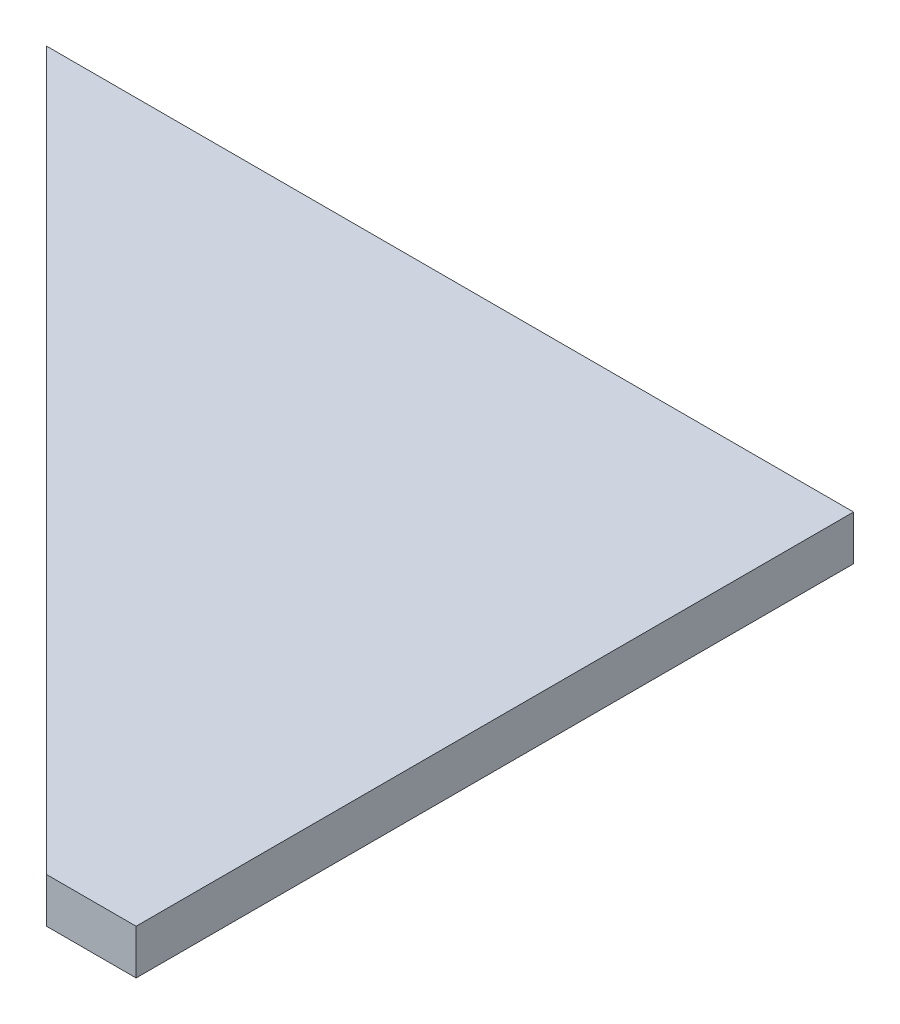
ISO-10303-21;
HEADER;
FILE_DESCRIPTION(('STEP AP214'),'2;1');
FILE_NAME('part.step','',(''),(''),'','','');
FILE_SCHEMA(('AUTOMOTIVE_DESIGN { 1 0 10303 214 1 1 1 1 }'));
ENDSEC;
DATA;
#1=APPLICATION_CONTEXT('core data for automotive mechanical design processes');
#2=APPLICATION_PROTOCOL_DEFINITION('international standard','automotive_design',2000,#1);
#3=PRODUCT_CONTEXT('',#1,'mechanical');
#4=PRODUCT('Part','Part','',(#3));
#5=PRODUCT_RELATED_PRODUCT_CATEGORY('part','',(#4));
#6=PRODUCT_DEFINITION_FORMATION('','',#4);
#7=PRODUCT_DEFINITION_CONTEXT('part definition',#1,'design');
#8=PRODUCT_DEFINITION('design','',#6,#7);
#9=PRODUCT_DEFINITION_SHAPE('','',#8);
#10=(LENGTH_UNIT() NAMED_UNIT(*) SI_UNIT(.MILLI.,.METRE.));
#11=(NAMED_UNIT(*) PLANE_ANGLE_UNIT() SI_UNIT($,.RADIAN.));
#12=(NAMED_UNIT(*) SI_UNIT($,.STERADIAN.) SOLID_ANGLE_UNIT());
#13=UNCERTAINTY_MEASURE_WITH_UNIT(LENGTH_MEASURE(1.E-05),#10,'distance_accuracy_value','');
#14=(GEOMETRIC_REPRESENTATION_CONTEXT(3) GLOBAL_UNCERTAINTY_ASSIGNED_CONTEXT((#13)) GLOBAL_UNIT_ASSIGNED_CONTEXT((#10,
#11,#12)) REPRESENTATION_CONTEXT('',''));
#15=CARTESIAN_POINT('',(0.,0.,0.));
#16=DIRECTION('',(0.,0.,1.));
#17=DIRECTION('',(1.,0.,0.));
#18=AXIS2_PLACEMENT_3D('',#15,#16,#17);
#19=CARTESIAN_POINT('',(0.,6.35,-50.8));
#20=DIRECTION('',(0.,0.,-1.));
#21=DIRECTION('',(-1.,0.,0.));
#22=AXIS2_PLACEMENT_3D('',#19,#20,#21);
#23=PLANE('',#22);
#24=DIRECTION('',(1.,0.,0.));
#25=VECTOR('',#24,1.);
#26=CARTESIAN_POINT('',(0.,0.,-50.8));
#27=LINE('',#26,#25);
#28=CARTESIAN_POINT('',(-107.95,0.,-50.8));
#29=VERTEX_POINT('',#28);
#30=CARTESIAN_POINT('',(6.35,0.,-50.8));
#31=VERTEX_POINT('',#30);
#32=EDGE_CURVE('E98',#29,#31,#27,.T.);
#33=ORIENTED_EDGE('',*,*,#32,.F.);
#34=DIRECTION('',(0.,-1.,0.));
#35=VECTOR('',#34,1.);
#36=CARTESIAN_POINT('',(-107.95,6.35,-50.8));
#37=LINE('',#36,#35);
#38=CARTESIAN_POINT('',(-107.95,6.35,-50.8));
#39=VERTEX_POINT('',#38);
#40=EDGE_CURVE('E11',#39,#29,#37,.T.);
#41=ORIENTED_EDGE('',*,*,#40,.F.);
#42=DIRECTION('',(1.,0.,0.));
#43=VECTOR('',#42,1.);
#44=CARTESIAN_POINT('',(0.,6.35,-50.8));
#45=LINE('',#44,#43);
#46=CARTESIAN_POINT('',(6.35,6.35,-50.8));
#47=VERTEX_POINT('',#46);
#48=EDGE_CURVE('E92',#39,#47,#45,.T.);
#49=ORIENTED_EDGE('',*,*,#48,.T.);
#50=DIRECTION('',(0.,-1.,0.));
#51=VECTOR('',#50,1.);
#52=CARTESIAN_POINT('',(6.35,6.35,-50.8));
#53=LINE('',#52,#51);
#54=EDGE_CURVE('E73',#47,#31,#53,.T.);
#55=ORIENTED_EDGE('',*,*,#54,.T.);
#56=EDGE_LOOP('',(#33,#41,#49,#55));
#57=FACE_BOUND('',#56,.T.);
#58=ADVANCED_FACE('F35',(#57),#23,.T.);
#59=CARTESIAN_POINT('',(-28.575,6.35,28.575));
#60=DIRECTION('',(-0.707106781186548,0.,0.707106781186548));
#61=DIRECTION('',(0.707106781186548,0.,0.707106781186548));
#62=AXIS2_PLACEMENT_3D('',#59,#60,#61);
#63=PLANE('',#62);
#64=DIRECTION('',(-0.707106781186548,0.,-0.707106781186548));
#65=VECTOR('',#64,1.);
#66=CARTESIAN_POINT('',(-28.575,0.,28.575));
#67=LINE('',#66,#65);
#68=CARTESIAN_POINT('',(-6.35,0.,50.8));
#69=VERTEX_POINT('',#68);
#70=EDGE_CURVE('E86',#69,#29,#67,.T.);
#71=ORIENTED_EDGE('',*,*,#70,.F.);
#72=DIRECTION('',(0.,-1.,0.));
#73=VECTOR('',#72,1.);
#74=CARTESIAN_POINT('',(-6.35,6.35,50.8));
#75=LINE('',#74,#73);
#76=CARTESIAN_POINT('',(-6.35,6.35,50.8));
#77=VERTEX_POINT('',#76);
#78=EDGE_CURVE('E43',#77,#69,#75,.T.);
#79=ORIENTED_EDGE('',*,*,#78,.F.);
#80=DIRECTION('',(-0.707106781186548,0.,-0.707106781186548));
#81=VECTOR('',#80,1.);
#82=CARTESIAN_POINT('',(-28.575,6.35,28.575));
#83=LINE('',#82,#81);
#84=EDGE_CURVE('E84',#77,#39,#83,.T.);
#85=ORIENTED_EDGE('',*,*,#84,.T.);
#86=ORIENTED_EDGE('',*,*,#40,.T.);
#87=EDGE_LOOP('',(#71,#79,#85,#86));
#88=FACE_BOUND('',#87,.T.);
#89=ADVANCED_FACE('F82',(#88),#63,.T.);
#90=CARTESIAN_POINT('',(0.,6.35,50.8));
#91=DIRECTION('',(0.,0.,-1.));
#92=DIRECTION('',(-1.,0.,0.));
#93=AXIS2_PLACEMENT_3D('',#90,#91,#92);
#94=PLANE('',#93);
#95=DIRECTION('',(1.,0.,0.));
#96=VECTOR('',#95,1.);
#97=CARTESIAN_POINT('',(0.,0.,50.8));
#98=LINE('',#97,#96);
#99=CARTESIAN_POINT('',(6.35,0.,50.8));
#100=VERTEX_POINT('',#99);
#101=EDGE_CURVE('E66',#69,#100,#98,.T.);
#102=ORIENTED_EDGE('',*,*,#101,.T.);
#103=DIRECTION('',(0.,-1.,0.));
#104=VECTOR('',#103,1.);
#105=CARTESIAN_POINT('',(6.35,6.35,50.8));
#106=LINE('',#105,#104);
#107=CARTESIAN_POINT('',(6.35,6.35,50.8));
#108=VERTEX_POINT('',#107);
#109=EDGE_CURVE('E87',#108,#100,#106,.T.);
#110=ORIENTED_EDGE('',*,*,#109,.F.);
#111=DIRECTION('',(1.,0.,0.));
#112=VECTOR('',#111,1.);
#113=CARTESIAN_POINT('',(0.,6.35,50.8));
#114=LINE('',#113,#112);
#115=EDGE_CURVE('E88',#77,#108,#114,.T.);
#116=ORIENTED_EDGE('',*,*,#115,.F.);
#117=ORIENTED_EDGE('',*,*,#78,.T.);
#118=EDGE_LOOP('',(#102,#110,#116,#117));
#119=FACE_BOUND('',#118,.T.);
#120=ADVANCED_FACE('F89',(#119),#94,.F.);
#121=CARTESIAN_POINT('',(6.35,6.35,0.));
#122=DIRECTION('',(-1.,0.,0.));
#123=DIRECTION('',(0.,0.,1.));
#124=AXIS2_PLACEMENT_3D('',#121,#122,#123);
#125=PLANE('',#124);
#126=DIRECTION('',(0.,0.,-1.));
#127=VECTOR('',#126,1.);
#128=CARTESIAN_POINT('',(6.35,0.,0.));
#129=LINE('',#128,#127);
#130=EDGE_CURVE('E94',#100,#31,#129,.T.);
#131=ORIENTED_EDGE('',*,*,#130,.T.);
#132=ORIENTED_EDGE('',*,*,#54,.F.);
#133=DIRECTION('',(0.,0.,-1.));
#134=VECTOR('',#133,1.);
#135=CARTESIAN_POINT('',(6.35,6.35,0.));
#136=LINE('',#135,#134);
#137=EDGE_CURVE('E51',#108,#47,#136,.T.);
#138=ORIENTED_EDGE('',*,*,#137,.F.);
#139=ORIENTED_EDGE('',*,*,#109,.T.);
#140=EDGE_LOOP('',(#131,#132,#138,#139));
#141=FACE_BOUND('',#140,.T.);
#142=ADVANCED_FACE('F107',(#141),#125,.F.);
#143=CARTESIAN_POINT('',(0.,6.35,0.));
#144=DIRECTION('',(0.,1.,0.));
#145=DIRECTION('',(0.,0.,1.));
#146=AXIS2_PLACEMENT_3D('',#143,#144,#145);
#147=PLANE('',#146);
#148=ORIENTED_EDGE('',*,*,#48,.F.);
#149=ORIENTED_EDGE('',*,*,#84,.F.);
#150=ORIENTED_EDGE('',*,*,#115,.T.);
#151=ORIENTED_EDGE('',*,*,#137,.T.);
#152=EDGE_LOOP('',(#148,#149,#150,#151));
#153=FACE_BOUND('',#152,.T.);
#154=ADVANCED_FACE('F91',(#153),#147,.T.);
#155=CARTESIAN_POINT('',(0.,0.,0.));
#156=DIRECTION('',(0.,1.,0.));
#157=DIRECTION('',(0.,0.,1.));
#158=AXIS2_PLACEMENT_3D('',#155,#156,#157);
#159=PLANE('',#158);
#160=ORIENTED_EDGE('',*,*,#32,.T.);
#161=ORIENTED_EDGE('',*,*,#130,.F.);
#162=ORIENTED_EDGE('',*,*,#101,.F.);
#163=ORIENTED_EDGE('',*,*,#70,.T.);
#164=EDGE_LOOP('',(#160,#161,#162,#163));
#165=FACE_BOUND('',#164,.T.);
#166=ADVANCED_FACE('F109',(#165),#159,.F.);
#167=CLOSED_SHELL('',(#58,#89,#120,#142,#154,#166));
#168=MANIFOLD_SOLID_BREP('B2',#167);
#169=ADVANCED_BREP_SHAPE_REPRESENTATION('',(#18,#168),#14);
#170=SHAPE_DEFINITION_REPRESENTATION(#9,#169);
ENDSEC;
END-ISO-10303-21;
